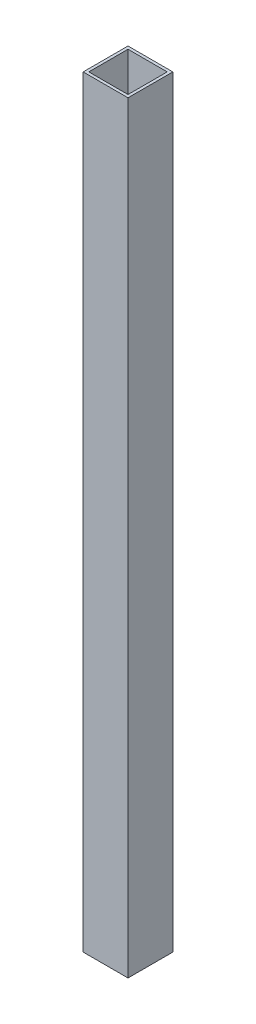
ISO-10303-21;
HEADER;
FILE_DESCRIPTION(('STEP AP214'),'2;1');
FILE_NAME('part.step','',(''),(''),'','','');
FILE_SCHEMA(('AUTOMOTIVE_DESIGN { 1 0 10303 214 1 1 1 1 }'));
ENDSEC;
DATA;
#1=APPLICATION_CONTEXT('core data for automotive mechanical design processes');
#2=APPLICATION_PROTOCOL_DEFINITION('international standard','automotive_design',2000,#1);
#3=PRODUCT_CONTEXT('',#1,'mechanical');
#4=PRODUCT('Part','Part','',(#3));
#5=PRODUCT_RELATED_PRODUCT_CATEGORY('part','',(#4));
#6=PRODUCT_DEFINITION_FORMATION('','',#4);
#7=PRODUCT_DEFINITION_CONTEXT('part definition',#1,'design');
#8=PRODUCT_DEFINITION('design','',#6,#7);
#9=PRODUCT_DEFINITION_SHAPE('','',#8);
#10=(LENGTH_UNIT() NAMED_UNIT(*) SI_UNIT(.MILLI.,.METRE.));
#11=(NAMED_UNIT(*) PLANE_ANGLE_UNIT() SI_UNIT($,.RADIAN.));
#12=(NAMED_UNIT(*) SI_UNIT($,.STERADIAN.) SOLID_ANGLE_UNIT());
#13=UNCERTAINTY_MEASURE_WITH_UNIT(LENGTH_MEASURE(1.E-05),#10,'distance_accuracy_value','');
#14=(GEOMETRIC_REPRESENTATION_CONTEXT(3) GLOBAL_UNCERTAINTY_ASSIGNED_CONTEXT((#13)) GLOBAL_UNIT_ASSIGNED_CONTEXT((#10,
#11,#12)) REPRESENTATION_CONTEXT('',''));
#15=CARTESIAN_POINT('',(0.,0.,0.));
#16=DIRECTION('',(0.,0.,1.));
#17=DIRECTION('',(1.,0.,0.));
#18=AXIS2_PLACEMENT_3D('',#15,#16,#17);
#19=CARTESIAN_POINT('',(0.,431.8,0.));
#20=DIRECTION('',(0.,-1.,0.));
#21=DIRECTION('',(0.,0.,-1.));
#22=AXIS2_PLACEMENT_3D('',#19,#20,#21);
#23=PLANE('',#22);
#24=DIRECTION('',(0.,0.,-1.));
#25=VECTOR('',#24,1.);
#26=CARTESIAN_POINT('',(12.7,431.8,12.7));
#27=LINE('',#26,#25);
#28=CARTESIAN_POINT('',(12.7,431.8,12.7));
#29=VERTEX_POINT('',#28);
#30=CARTESIAN_POINT('',(12.7,431.8,-12.7));
#31=VERTEX_POINT('',#30);
#32=EDGE_CURVE('E135',#29,#31,#27,.T.);
#33=ORIENTED_EDGE('',*,*,#32,.T.);
#34=DIRECTION('',(-1.,0.,0.));
#35=VECTOR('',#34,1.);
#36=CARTESIAN_POINT('',(-12.7,431.8,-12.7));
#37=LINE('',#36,#35);
#38=CARTESIAN_POINT('',(-12.7,431.8,-12.7));
#39=VERTEX_POINT('',#38);
#40=EDGE_CURVE('E138',#31,#39,#37,.T.);
#41=ORIENTED_EDGE('',*,*,#40,.T.);
#42=DIRECTION('',(0.,0.,1.));
#43=VECTOR('',#42,1.);
#44=CARTESIAN_POINT('',(-12.7,431.8,12.7));
#45=LINE('',#44,#43);
#46=CARTESIAN_POINT('',(-12.7,431.8,12.7));
#47=VERTEX_POINT('',#46);
#48=EDGE_CURVE('E141',#39,#47,#45,.T.);
#49=ORIENTED_EDGE('',*,*,#48,.T.);
#50=DIRECTION('',(1.,0.,0.));
#51=VECTOR('',#50,1.);
#52=CARTESIAN_POINT('',(-12.7,431.8,12.7));
#53=LINE('',#52,#51);
#54=EDGE_CURVE('E143',#47,#29,#53,.T.);
#55=ORIENTED_EDGE('',*,*,#54,.T.);
#56=EDGE_LOOP('',(#33,#41,#49,#55));
#57=FACE_BOUND('',#56,.T.);
#58=DIRECTION('',(0.,0.,-1.));
#59=VECTOR('',#58,1.);
#60=CARTESIAN_POINT('',(11.1125,431.8,11.1125));
#61=LINE('',#60,#59);
#62=CARTESIAN_POINT('',(11.1125,431.8,11.1125));
#63=VERTEX_POINT('',#62);
#64=CARTESIAN_POINT('',(11.1125,431.8,-11.1125));
#65=VERTEX_POINT('',#64);
#66=EDGE_CURVE('E99',#63,#65,#61,.T.);
#67=ORIENTED_EDGE('',*,*,#66,.F.);
#68=DIRECTION('',(1.,0.,0.));
#69=VECTOR('',#68,1.);
#70=CARTESIAN_POINT('',(-11.1125,431.8,11.1125));
#71=LINE('',#70,#69);
#72=CARTESIAN_POINT('',(-11.1125,431.8,11.1125));
#73=VERTEX_POINT('',#72);
#74=EDGE_CURVE('E121',#73,#63,#71,.T.);
#75=ORIENTED_EDGE('',*,*,#74,.F.);
#76=DIRECTION('',(0.,0.,1.));
#77=VECTOR('',#76,1.);
#78=CARTESIAN_POINT('',(-11.1125,431.8,11.1125));
#79=LINE('',#78,#77);
#80=CARTESIAN_POINT('',(-11.1125,431.8,-11.1125));
#81=VERTEX_POINT('',#80);
#82=EDGE_CURVE('E119',#81,#73,#79,.T.);
#83=ORIENTED_EDGE('',*,*,#82,.F.);
#84=DIRECTION('',(-1.,0.,0.));
#85=VECTOR('',#84,1.);
#86=CARTESIAN_POINT('',(-11.1125,431.8,-11.1125));
#87=LINE('',#86,#85);
#88=EDGE_CURVE('E107',#65,#81,#87,.T.);
#89=ORIENTED_EDGE('',*,*,#88,.F.);
#90=EDGE_LOOP('',(#67,#75,#83,#89));
#91=FACE_BOUND('',#90,.T.);
#92=ADVANCED_FACE('F34',(#57,#91),#23,.F.);
#93=CARTESIAN_POINT('',(0.,0.,0.));
#94=DIRECTION('',(0.,-1.,0.));
#95=DIRECTION('',(0.,0.,-1.));
#96=AXIS2_PLACEMENT_3D('',#93,#94,#95);
#97=PLANE('',#96);
#98=DIRECTION('',(0.,0.,-1.));
#99=VECTOR('',#98,1.);
#100=CARTESIAN_POINT('',(12.7,0.,12.7));
#101=LINE('',#100,#99);
#102=CARTESIAN_POINT('',(12.7,0.,12.7));
#103=VERTEX_POINT('',#102);
#104=CARTESIAN_POINT('',(12.7,0.,-12.7));
#105=VERTEX_POINT('',#104);
#106=EDGE_CURVE('E115',#103,#105,#101,.T.);
#107=ORIENTED_EDGE('',*,*,#106,.F.);
#108=DIRECTION('',(1.,0.,0.));
#109=VECTOR('',#108,1.);
#110=CARTESIAN_POINT('',(-12.7,0.,12.7));
#111=LINE('',#110,#109);
#112=CARTESIAN_POINT('',(-12.7,0.,12.7));
#113=VERTEX_POINT('',#112);
#114=EDGE_CURVE('E139',#113,#103,#111,.T.);
#115=ORIENTED_EDGE('',*,*,#114,.F.);
#116=DIRECTION('',(0.,0.,1.));
#117=VECTOR('',#116,1.);
#118=CARTESIAN_POINT('',(-12.7,0.,12.7));
#119=LINE('',#118,#117);
#120=CARTESIAN_POINT('',(-12.7,0.,-12.7));
#121=VERTEX_POINT('',#120);
#122=EDGE_CURVE('E150',#121,#113,#119,.T.);
#123=ORIENTED_EDGE('',*,*,#122,.F.);
#124=DIRECTION('',(-1.,0.,0.));
#125=VECTOR('',#124,1.);
#126=CARTESIAN_POINT('',(-12.7,0.,-12.7));
#127=LINE('',#126,#125);
#128=EDGE_CURVE('E148',#105,#121,#127,.T.);
#129=ORIENTED_EDGE('',*,*,#128,.F.);
#130=EDGE_LOOP('',(#107,#115,#123,#129));
#131=FACE_BOUND('',#130,.T.);
#132=DIRECTION('',(1.,0.,0.));
#133=VECTOR('',#132,1.);
#134=CARTESIAN_POINT('',(-11.1125,0.,11.1125));
#135=LINE('',#134,#133);
#136=CARTESIAN_POINT('',(-11.1125,0.,11.1125));
#137=VERTEX_POINT('',#136);
#138=CARTESIAN_POINT('',(11.1125,0.,11.1125));
#139=VERTEX_POINT('',#138);
#140=EDGE_CURVE('E108',#137,#139,#135,.T.);
#141=ORIENTED_EDGE('',*,*,#140,.T.);
#142=DIRECTION('',(0.,0.,-1.));
#143=VECTOR('',#142,1.);
#144=CARTESIAN_POINT('',(11.1125,0.,11.1125));
#145=LINE('',#144,#143);
#146=CARTESIAN_POINT('',(11.1125,0.,-11.1125));
#147=VERTEX_POINT('',#146);
#148=EDGE_CURVE('E57',#139,#147,#145,.T.);
#149=ORIENTED_EDGE('',*,*,#148,.T.);
#150=DIRECTION('',(-1.,0.,0.));
#151=VECTOR('',#150,1.);
#152=CARTESIAN_POINT('',(-11.1125,0.,-11.1125));
#153=LINE('',#152,#151);
#154=CARTESIAN_POINT('',(-11.1125,0.,-11.1125));
#155=VERTEX_POINT('',#154);
#156=EDGE_CURVE('E114',#147,#155,#153,.T.);
#157=ORIENTED_EDGE('',*,*,#156,.T.);
#158=DIRECTION('',(0.,0.,1.));
#159=VECTOR('',#158,1.);
#160=CARTESIAN_POINT('',(-11.1125,0.,11.1125));
#161=LINE('',#160,#159);
#162=EDGE_CURVE('E127',#155,#137,#161,.T.);
#163=ORIENTED_EDGE('',*,*,#162,.T.);
#164=EDGE_LOOP('',(#141,#149,#157,#163));
#165=FACE_BOUND('',#164,.T.);
#166=ADVANCED_FACE('F168',(#131,#165),#97,.T.);
#167=CARTESIAN_POINT('',(12.7,431.8,12.7));
#168=DIRECTION('',(-1.,0.,0.));
#169=DIRECTION('',(0.,0.,1.));
#170=AXIS2_PLACEMENT_3D('',#167,#168,#169);
#171=PLANE('',#170);
#172=ORIENTED_EDGE('',*,*,#106,.T.);
#173=DIRECTION('',(0.,-1.,0.));
#174=VECTOR('',#173,1.);
#175=CARTESIAN_POINT('',(12.7,431.8,-12.7));
#176=LINE('',#175,#174);
#177=EDGE_CURVE('E11',#31,#105,#176,.T.);
#178=ORIENTED_EDGE('',*,*,#177,.F.);
#179=ORIENTED_EDGE('',*,*,#32,.F.);
#180=DIRECTION('',(0.,-1.,0.));
#181=VECTOR('',#180,1.);
#182=CARTESIAN_POINT('',(12.7,431.8,12.7));
#183=LINE('',#182,#181);
#184=EDGE_CURVE('E145',#29,#103,#183,.T.);
#185=ORIENTED_EDGE('',*,*,#184,.T.);
#186=EDGE_LOOP('',(#172,#178,#179,#185));
#187=FACE_BOUND('',#186,.T.);
#188=ADVANCED_FACE('F36',(#187),#171,.F.);
#189=CARTESIAN_POINT('',(-12.7,431.8,-12.7));
#190=DIRECTION('',(0.,0.,1.));
#191=DIRECTION('',(1.,0.,0.));
#192=AXIS2_PLACEMENT_3D('',#189,#190,#191);
#193=PLANE('',#192);
#194=ORIENTED_EDGE('',*,*,#128,.T.);
#195=DIRECTION('',(0.,-1.,0.));
#196=VECTOR('',#195,1.);
#197=CARTESIAN_POINT('',(-12.7,431.8,-12.7));
#198=LINE('',#197,#196);
#199=EDGE_CURVE('E42',#39,#121,#198,.T.);
#200=ORIENTED_EDGE('',*,*,#199,.F.);
#201=ORIENTED_EDGE('',*,*,#40,.F.);
#202=ORIENTED_EDGE('',*,*,#177,.T.);
#203=EDGE_LOOP('',(#194,#200,#201,#202));
#204=FACE_BOUND('',#203,.T.);
#205=ADVANCED_FACE('F178',(#204),#193,.F.);
#206=CARTESIAN_POINT('',(-12.7,431.8,12.7));
#207=DIRECTION('',(1.,0.,0.));
#208=DIRECTION('',(0.,0.,-1.));
#209=AXIS2_PLACEMENT_3D('',#206,#207,#208);
#210=PLANE('',#209);
#211=ORIENTED_EDGE('',*,*,#122,.T.);
#212=DIRECTION('',(0.,-1.,0.));
#213=VECTOR('',#212,1.);
#214=CARTESIAN_POINT('',(-12.7,431.8,12.7));
#215=LINE('',#214,#213);
#216=EDGE_CURVE('E155',#47,#113,#215,.T.);
#217=ORIENTED_EDGE('',*,*,#216,.F.);
#218=ORIENTED_EDGE('',*,*,#48,.F.);
#219=ORIENTED_EDGE('',*,*,#199,.T.);
#220=EDGE_LOOP('',(#211,#217,#218,#219));
#221=FACE_BOUND('',#220,.T.);
#222=ADVANCED_FACE('F162',(#221),#210,.F.);
#223=CARTESIAN_POINT('',(-12.7,431.8,12.7));
#224=DIRECTION('',(0.,0.,-1.));
#225=DIRECTION('',(-1.,0.,0.));
#226=AXIS2_PLACEMENT_3D('',#223,#224,#225);
#227=PLANE('',#226);
#228=ORIENTED_EDGE('',*,*,#114,.T.);
#229=ORIENTED_EDGE('',*,*,#184,.F.);
#230=ORIENTED_EDGE('',*,*,#54,.F.);
#231=ORIENTED_EDGE('',*,*,#216,.T.);
#232=EDGE_LOOP('',(#228,#229,#230,#231));
#233=FACE_BOUND('',#232,.T.);
#234=ADVANCED_FACE('F172',(#233),#227,.F.);
#235=CARTESIAN_POINT('',(11.1125,431.8,11.1125));
#236=DIRECTION('',(-1.,0.,0.));
#237=DIRECTION('',(0.,0.,1.));
#238=AXIS2_PLACEMENT_3D('',#235,#236,#237);
#239=PLANE('',#238);
#240=ORIENTED_EDGE('',*,*,#148,.F.);
#241=DIRECTION('',(0.,-1.,0.));
#242=VECTOR('',#241,1.);
#243=CARTESIAN_POINT('',(11.1125,431.8,11.1125));
#244=LINE('',#243,#242);
#245=EDGE_CURVE('E103',#63,#139,#244,.T.);
#246=ORIENTED_EDGE('',*,*,#245,.F.);
#247=ORIENTED_EDGE('',*,*,#66,.T.);
#248=DIRECTION('',(0.,-1.,0.));
#249=VECTOR('',#248,1.);
#250=CARTESIAN_POINT('',(11.1125,431.8,-11.1125));
#251=LINE('',#250,#249);
#252=EDGE_CURVE('E102',#65,#147,#251,.T.);
#253=ORIENTED_EDGE('',*,*,#252,.T.);
#254=EDGE_LOOP('',(#240,#246,#247,#253));
#255=FACE_BOUND('',#254,.T.);
#256=ADVANCED_FACE('F101',(#255),#239,.T.);
#257=CARTESIAN_POINT('',(-11.1125,431.8,-11.1125));
#258=DIRECTION('',(0.,0.,1.));
#259=DIRECTION('',(1.,0.,0.));
#260=AXIS2_PLACEMENT_3D('',#257,#258,#259);
#261=PLANE('',#260);
#262=ORIENTED_EDGE('',*,*,#156,.F.);
#263=ORIENTED_EDGE('',*,*,#252,.F.);
#264=ORIENTED_EDGE('',*,*,#88,.T.);
#265=DIRECTION('',(0.,-1.,0.));
#266=VECTOR('',#265,1.);
#267=CARTESIAN_POINT('',(-11.1125,431.8,-11.1125));
#268=LINE('',#267,#266);
#269=EDGE_CURVE('E116',#81,#155,#268,.T.);
#270=ORIENTED_EDGE('',*,*,#269,.T.);
#271=EDGE_LOOP('',(#262,#263,#264,#270));
#272=FACE_BOUND('',#271,.T.);
#273=ADVANCED_FACE('F111',(#272),#261,.T.);
#274=CARTESIAN_POINT('',(-11.1125,431.8,11.1125));
#275=DIRECTION('',(1.,0.,0.));
#276=DIRECTION('',(0.,0.,-1.));
#277=AXIS2_PLACEMENT_3D('',#274,#275,#276);
#278=PLANE('',#277);
#279=ORIENTED_EDGE('',*,*,#162,.F.);
#280=ORIENTED_EDGE('',*,*,#269,.F.);
#281=ORIENTED_EDGE('',*,*,#82,.T.);
#282=DIRECTION('',(0.,-1.,0.));
#283=VECTOR('',#282,1.);
#284=CARTESIAN_POINT('',(-11.1125,431.8,11.1125));
#285=LINE('',#284,#283);
#286=EDGE_CURVE('E49',#73,#137,#285,.T.);
#287=ORIENTED_EDGE('',*,*,#286,.T.);
#288=EDGE_LOOP('',(#279,#280,#281,#287));
#289=FACE_BOUND('',#288,.T.);
#290=ADVANCED_FACE('F201',(#289),#278,.T.);
#291=CARTESIAN_POINT('',(-11.1125,431.8,11.1125));
#292=DIRECTION('',(0.,0.,-1.));
#293=DIRECTION('',(-1.,0.,0.));
#294=AXIS2_PLACEMENT_3D('',#291,#292,#293);
#295=PLANE('',#294);
#296=ORIENTED_EDGE('',*,*,#140,.F.);
#297=ORIENTED_EDGE('',*,*,#286,.F.);
#298=ORIENTED_EDGE('',*,*,#74,.T.);
#299=ORIENTED_EDGE('',*,*,#245,.T.);
#300=EDGE_LOOP('',(#296,#297,#298,#299));
#301=FACE_BOUND('',#300,.T.);
#302=ADVANCED_FACE('F205',(#301),#295,.T.);
#303=CLOSED_SHELL('',(#92,#166,#188,#205,#222,#234,#256,#273,#290,#302));
#304=MANIFOLD_SOLID_BREP('B2',#303);
#305=ADVANCED_BREP_SHAPE_REPRESENTATION('',(#18,#304),#14);
#306=SHAPE_DEFINITION_REPRESENTATION(#9,#305);
ENDSEC;
END-ISO-10303-21;
